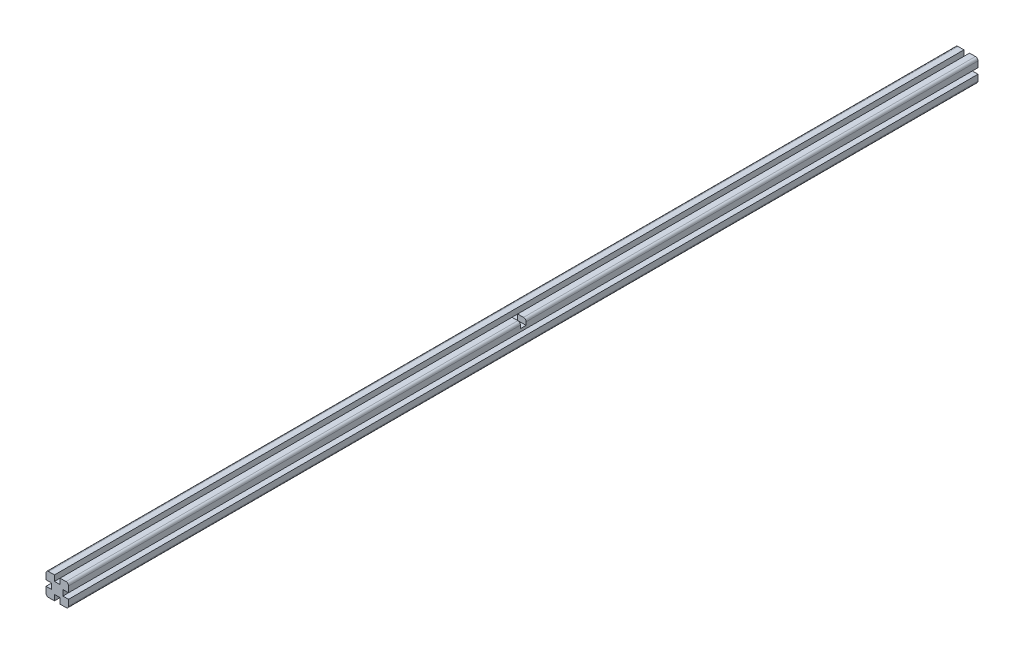
ISO-10303-21;
HEADER;
FILE_DESCRIPTION(('STEP AP214'),'2;1');
FILE_NAME('part.step','',(''),(''),'','','');
FILE_SCHEMA(('AUTOMOTIVE_DESIGN { 1 0 10303 214 1 1 1 1 }'));
ENDSEC;
DATA;
#1=APPLICATION_CONTEXT('core data for automotive mechanical design processes');
#2=APPLICATION_PROTOCOL_DEFINITION('international standard','automotive_design',2000,#1);
#3=PRODUCT_CONTEXT('',#1,'mechanical');
#4=PRODUCT('Part','Part','',(#3));
#5=PRODUCT_RELATED_PRODUCT_CATEGORY('part','',(#4));
#6=PRODUCT_DEFINITION_FORMATION('','',#4);
#7=PRODUCT_DEFINITION_CONTEXT('part definition',#1,'design');
#8=PRODUCT_DEFINITION('design','',#6,#7);
#9=PRODUCT_DEFINITION_SHAPE('','',#8);
#10=(LENGTH_UNIT() NAMED_UNIT(*) SI_UNIT(.MILLI.,.METRE.));
#11=(NAMED_UNIT(*) PLANE_ANGLE_UNIT() SI_UNIT($,.RADIAN.));
#12=(NAMED_UNIT(*) SI_UNIT($,.STERADIAN.) SOLID_ANGLE_UNIT());
#13=UNCERTAINTY_MEASURE_WITH_UNIT(LENGTH_MEASURE(1.E-05),#10,'distance_accuracy_value','');
#14=(GEOMETRIC_REPRESENTATION_CONTEXT(3) GLOBAL_UNCERTAINTY_ASSIGNED_CONTEXT((#13)) GLOBAL_UNIT_ASSIGNED_CONTEXT((#10,
#11,#12)) REPRESENTATION_CONTEXT('',''));
#15=CARTESIAN_POINT('',(0.,0.,0.));
#16=DIRECTION('',(0.,0.,1.));
#17=DIRECTION('',(1.,0.,0.));
#18=AXIS2_PLACEMENT_3D('',#15,#16,#17);
#19=CARTESIAN_POINT('',(15.5,15.5,1615.));
#20=DIRECTION('',(0.,0.,-1.));
#21=DIRECTION('',(-1.,0.,0.));
#22=AXIS2_PLACEMENT_3D('',#19,#20,#21);
#23=CYLINDRICAL_SURFACE('',#22,4.5);
#24=DIRECTION('',(0.,0.,-1.));
#25=VECTOR('',#24,1.);
#26=CARTESIAN_POINT('',(15.5,20.,1615.));
#27=LINE('',#26,#25);
#28=CARTESIAN_POINT('',(15.5,20.,802.5));
#29=VERTEX_POINT('',#28);
#30=CARTESIAN_POINT('',(15.5,20.,0.));
#31=VERTEX_POINT('',#30);
#32=EDGE_CURVE('E325',#29,#31,#27,.T.);
#33=ORIENTED_EDGE('',*,*,#32,.F.);
#34=CARTESIAN_POINT('',(15.5,15.5,802.5));
#35=DIRECTION('',(0.,0.,-1.));
#36=DIRECTION('',(-1.,0.,0.));
#37=AXIS2_PLACEMENT_3D('',#34,#35,#36);
#38=CIRCLE('',#37,4.5);
#39=CARTESIAN_POINT('',(20.,15.5,802.5));
#40=VERTEX_POINT('',#39);
#41=EDGE_CURVE('E440',#40,#29,#38,.F.);
#42=ORIENTED_EDGE('',*,*,#41,.F.);
#43=DIRECTION('',(0.,0.,-1.));
#44=VECTOR('',#43,1.);
#45=CARTESIAN_POINT('',(20.,15.5,1615.));
#46=LINE('',#45,#44);
#47=CARTESIAN_POINT('',(20.,15.5,0.));
#48=VERTEX_POINT('',#47);
#49=EDGE_CURVE('E329',#40,#48,#46,.T.);
#50=ORIENTED_EDGE('',*,*,#49,.T.);
#51=CARTESIAN_POINT('',(15.5,15.5,0.));
#52=DIRECTION('',(0.,0.,1.));
#53=DIRECTION('',(-1.,0.,0.));
#54=AXIS2_PLACEMENT_3D('',#51,#52,#53);
#55=CIRCLE('',#54,4.5);
#56=EDGE_CURVE('E262',#48,#31,#55,.T.);
#57=ORIENTED_EDGE('',*,*,#56,.T.);
#58=EDGE_LOOP('',(#33,#42,#50,#57));
#59=FACE_BOUND('',#58,.T.);
#60=ADVANCED_FACE('F35',(#59),#23,.T.);
#61=CARTESIAN_POINT('',(4.99999999999999,20.,1615.));
#62=DIRECTION('',(0.,-1.,0.));
#63=DIRECTION('',(0.,0.,-1.));
#64=AXIS2_PLACEMENT_3D('',#61,#62,#63);
#65=PLANE('',#64);
#66=DIRECTION('',(0.,0.,-1.));
#67=VECTOR('',#66,1.);
#68=CARTESIAN_POINT('',(4.99999999999999,20.,1615.));
#69=LINE('',#68,#67);
#70=CARTESIAN_POINT('',(4.99999999999999,20.,802.5));
#71=VERTEX_POINT('',#70);
#72=CARTESIAN_POINT('',(4.99999999999999,20.,0.));
#73=VERTEX_POINT('',#72);
#74=EDGE_CURVE('E321',#71,#73,#69,.T.);
#75=ORIENTED_EDGE('',*,*,#74,.F.);
#76=DIRECTION('',(1.,0.,0.));
#77=VECTOR('',#76,1.);
#78=CARTESIAN_POINT('',(-20.001,20.,802.5));
#79=LINE('',#78,#77);
#80=EDGE_CURVE('E434',#71,#29,#79,.T.);
#81=ORIENTED_EDGE('',*,*,#80,.T.);
#82=ORIENTED_EDGE('',*,*,#32,.T.);
#83=DIRECTION('',(-1.,0.,0.));
#84=VECTOR('',#83,1.);
#85=CARTESIAN_POINT('',(4.99999999999999,20.,0.));
#86=LINE('',#85,#84);
#87=EDGE_CURVE('E265',#31,#73,#86,.T.);
#88=ORIENTED_EDGE('',*,*,#87,.T.);
#89=EDGE_LOOP('',(#75,#81,#82,#88));
#90=FACE_BOUND('',#89,.T.);
#91=ADVANCED_FACE('F479',(#90),#65,.F.);
#92=CARTESIAN_POINT('',(4.99999999999999,20.,1615.));
#93=DIRECTION('',(1.,0.,0.));
#94=DIRECTION('',(0.,1.,0.));
#95=AXIS2_PLACEMENT_3D('',#92,#93,#94);
#96=PLANE('',#95);
#97=DIRECTION('',(0.,0.,-1.));
#98=VECTOR('',#97,1.);
#99=CARTESIAN_POINT('',(5.,10.,1615.));
#100=LINE('',#99,#98);
#101=CARTESIAN_POINT('',(5.,10.,802.5));
#102=VERTEX_POINT('',#101);
#103=CARTESIAN_POINT('',(5.,10.,0.));
#104=VERTEX_POINT('',#103);
#105=EDGE_CURVE('E317',#102,#104,#100,.T.);
#106=ORIENTED_EDGE('',*,*,#105,.F.);
#107=DIRECTION('',(0.,-1.,0.));
#108=VECTOR('',#107,1.);
#109=CARTESIAN_POINT('',(5.,10.0000000000001,802.5));
#110=LINE('',#109,#108);
#111=EDGE_CURVE('E50',#71,#102,#110,.T.);
#112=ORIENTED_EDGE('',*,*,#111,.F.);
#113=ORIENTED_EDGE('',*,*,#74,.T.);
#114=DIRECTION('',(0.,-1.,0.));
#115=VECTOR('',#114,1.);
#116=CARTESIAN_POINT('',(4.99999999999999,20.,0.));
#117=LINE('',#116,#115);
#118=EDGE_CURVE('E268',#73,#104,#117,.T.);
#119=ORIENTED_EDGE('',*,*,#118,.T.);
#120=EDGE_LOOP('',(#106,#112,#113,#119));
#121=FACE_BOUND('',#120,.T.);
#122=ADVANCED_FACE('F486',(#121),#96,.F.);
#123=CARTESIAN_POINT('',(-5.,-20.,1615.));
#124=DIRECTION('',(-1.,0.,0.));
#125=DIRECTION('',(0.,-1.,0.));
#126=AXIS2_PLACEMENT_3D('',#123,#124,#125);
#127=PLANE('',#126);
#128=DIRECTION('',(0.,1.,0.));
#129=VECTOR('',#128,1.);
#130=CARTESIAN_POINT('',(-5.,-20.,0.));
#131=LINE('',#130,#129);
#132=CARTESIAN_POINT('',(-5.,-20.,0.));
#133=VERTEX_POINT('',#132);
#134=CARTESIAN_POINT('',(-5.,-10.,0.));
#135=VERTEX_POINT('',#134);
#136=EDGE_CURVE('E240',#133,#135,#131,.T.);
#137=ORIENTED_EDGE('',*,*,#136,.T.);
#138=DIRECTION('',(0.,0.,-1.));
#139=VECTOR('',#138,1.);
#140=CARTESIAN_POINT('',(-5.,-10.,1615.));
#141=LINE('',#140,#139);
#142=CARTESIAN_POINT('',(-5.,-10.,1615.));
#143=VERTEX_POINT('',#142);
#144=EDGE_CURVE('E11',#143,#135,#141,.T.);
#145=ORIENTED_EDGE('',*,*,#144,.F.);
#146=DIRECTION('',(0.,1.,0.));
#147=VECTOR('',#146,1.);
#148=CARTESIAN_POINT('',(-5.,-20.,1615.));
#149=LINE('',#148,#147);
#150=CARTESIAN_POINT('',(-5.,-20.,1615.));
#151=VERTEX_POINT('',#150);
#152=EDGE_CURVE('E292',#151,#143,#149,.T.);
#153=ORIENTED_EDGE('',*,*,#152,.F.);
#154=DIRECTION('',(0.,0.,-1.));
#155=VECTOR('',#154,1.);
#156=CARTESIAN_POINT('',(-5.,-20.,1615.));
#157=LINE('',#156,#155);
#158=EDGE_CURVE('E236',#151,#133,#157,.T.);
#159=ORIENTED_EDGE('',*,*,#158,.T.);
#160=EDGE_LOOP('',(#137,#145,#153,#159));
#161=FACE_BOUND('',#160,.T.);
#162=ADVANCED_FACE('F37',(#161),#127,.F.);
#163=CARTESIAN_POINT('',(-5.,-10.,1615.));
#164=DIRECTION('',(0.,1.,0.));
#165=DIRECTION('',(-1.,0.,0.));
#166=AXIS2_PLACEMENT_3D('',#163,#164,#165);
#167=PLANE('',#166);
#168=DIRECTION('',(1.,0.,0.));
#169=VECTOR('',#168,1.);
#170=CARTESIAN_POINT('',(-5.,-10.,0.));
#171=LINE('',#170,#169);
#172=CARTESIAN_POINT('',(5.,-10.,0.));
#173=VERTEX_POINT('',#172);
#174=EDGE_CURVE('E243',#135,#173,#171,.T.);
#175=ORIENTED_EDGE('',*,*,#174,.T.);
#176=DIRECTION('',(0.,0.,-1.));
#177=VECTOR('',#176,1.);
#178=CARTESIAN_POINT('',(5.,-10.,1615.));
#179=LINE('',#178,#177);
#180=CARTESIAN_POINT('',(5.,-10.,1615.));
#181=VERTEX_POINT('',#180);
#182=EDGE_CURVE('E43',#181,#173,#179,.T.);
#183=ORIENTED_EDGE('',*,*,#182,.F.);
#184=DIRECTION('',(1.,0.,0.));
#185=VECTOR('',#184,1.);
#186=CARTESIAN_POINT('',(-5.,-10.,1615.));
#187=LINE('',#186,#185);
#188=EDGE_CURVE('E148',#143,#181,#187,.T.);
#189=ORIENTED_EDGE('',*,*,#188,.F.);
#190=ORIENTED_EDGE('',*,*,#144,.T.);
#191=EDGE_LOOP('',(#175,#183,#189,#190));
#192=FACE_BOUND('',#191,.T.);
#193=ADVANCED_FACE('F751',(#192),#167,.F.);
#194=CARTESIAN_POINT('',(5.,-20.,1615.));
#195=DIRECTION('',(1.,0.,0.));
#196=DIRECTION('',(0.,0.,-1.));
#197=AXIS2_PLACEMENT_3D('',#194,#195,#196);
#198=PLANE('',#197);
#199=DIRECTION('',(0.,-1.,0.));
#200=VECTOR('',#199,1.);
#201=CARTESIAN_POINT('',(5.,-20.,0.));
#202=LINE('',#201,#200);
#203=CARTESIAN_POINT('',(5.,-20.,0.));
#204=VERTEX_POINT('',#203);
#205=EDGE_CURVE('E245',#173,#204,#202,.T.);
#206=ORIENTED_EDGE('',*,*,#205,.T.);
#207=DIRECTION('',(0.,0.,-1.));
#208=VECTOR('',#207,1.);
#209=CARTESIAN_POINT('',(5.,-20.,1615.));
#210=LINE('',#209,#208);
#211=CARTESIAN_POINT('',(5.,-20.,1615.));
#212=VERTEX_POINT('',#211);
#213=EDGE_CURVE('E351',#212,#204,#210,.T.);
#214=ORIENTED_EDGE('',*,*,#213,.F.);
#215=DIRECTION('',(0.,-1.,0.));
#216=VECTOR('',#215,1.);
#217=CARTESIAN_POINT('',(5.,-20.,1615.));
#218=LINE('',#217,#216);
#219=EDGE_CURVE('E359',#181,#212,#218,.T.);
#220=ORIENTED_EDGE('',*,*,#219,.F.);
#221=ORIENTED_EDGE('',*,*,#182,.T.);
#222=EDGE_LOOP('',(#206,#214,#220,#221));
#223=FACE_BOUND('',#222,.T.);
#224=ADVANCED_FACE('F357',(#223),#198,.F.);
#225=CARTESIAN_POINT('',(5.,-20.,1615.));
#226=DIRECTION('',(0.,1.,0.));
#227=DIRECTION('',(0.,0.,1.));
#228=AXIS2_PLACEMENT_3D('',#225,#226,#227);
#229=PLANE('',#228);
#230=DIRECTION('',(1.,0.,0.));
#231=VECTOR('',#230,1.);
#232=CARTESIAN_POINT('',(5.,-20.,0.));
#233=LINE('',#232,#231);
#234=CARTESIAN_POINT('',(15.5,-20.,0.));
#235=VERTEX_POINT('',#234);
#236=EDGE_CURVE('E247',#204,#235,#233,.T.);
#237=ORIENTED_EDGE('',*,*,#236,.T.);
#238=DIRECTION('',(0.,0.,-1.));
#239=VECTOR('',#238,1.);
#240=CARTESIAN_POINT('',(15.5,-20.,1615.));
#241=LINE('',#240,#239);
#242=CARTESIAN_POINT('',(15.5,-20.,1615.));
#243=VERTEX_POINT('',#242);
#244=EDGE_CURVE('E348',#243,#235,#241,.T.);
#245=ORIENTED_EDGE('',*,*,#244,.F.);
#246=DIRECTION('',(1.,0.,0.));
#247=VECTOR('',#246,1.);
#248=CARTESIAN_POINT('',(5.,-20.,1615.));
#249=LINE('',#248,#247);
#250=EDGE_CURVE('E377',#212,#243,#249,.T.);
#251=ORIENTED_EDGE('',*,*,#250,.F.);
#252=ORIENTED_EDGE('',*,*,#213,.T.);
#253=EDGE_LOOP('',(#237,#245,#251,#252));
#254=FACE_BOUND('',#253,.T.);
#255=ADVANCED_FACE('F368',(#254),#229,.F.);
#256=CARTESIAN_POINT('',(15.5,-15.5,1615.));
#257=DIRECTION('',(0.,0.,-1.));
#258=DIRECTION('',(-1.,0.,0.));
#259=AXIS2_PLACEMENT_3D('',#256,#257,#258);
#260=CYLINDRICAL_SURFACE('',#259,4.5);
#261=CARTESIAN_POINT('',(15.5,-15.5,0.));
#262=DIRECTION('',(0.,0.,1.));
#263=DIRECTION('',(1.,0.,0.));
#264=AXIS2_PLACEMENT_3D('',#261,#262,#263);
#265=CIRCLE('',#264,4.5);
#266=CARTESIAN_POINT('',(20.,-15.5,0.));
#267=VERTEX_POINT('',#266);
#268=EDGE_CURVE('E249',#235,#267,#265,.T.);
#269=ORIENTED_EDGE('',*,*,#268,.T.);
#270=DIRECTION('',(0.,0.,-1.));
#271=VECTOR('',#270,1.);
#272=CARTESIAN_POINT('',(20.,-15.5,1615.));
#273=LINE('',#272,#271);
#274=CARTESIAN_POINT('',(20.,-15.5,1615.));
#275=VERTEX_POINT('',#274);
#276=EDGE_CURVE('E345',#275,#267,#273,.T.);
#277=ORIENTED_EDGE('',*,*,#276,.F.);
#278=CARTESIAN_POINT('',(15.5,-15.5,1615.));
#279=DIRECTION('',(0.,0.,1.));
#280=DIRECTION('',(1.,0.,0.));
#281=AXIS2_PLACEMENT_3D('',#278,#279,#280);
#282=CIRCLE('',#281,4.5);
#283=EDGE_CURVE('E374',#243,#275,#282,.T.);
#284=ORIENTED_EDGE('',*,*,#283,.F.);
#285=ORIENTED_EDGE('',*,*,#244,.T.);
#286=EDGE_LOOP('',(#269,#277,#284,#285));
#287=FACE_BOUND('',#286,.T.);
#288=ADVANCED_FACE('F372',(#287),#260,.T.);
#289=CARTESIAN_POINT('',(20.,-15.5,1615.));
#290=DIRECTION('',(-1.,0.,0.));
#291=DIRECTION('',(0.,0.,1.));
#292=AXIS2_PLACEMENT_3D('',#289,#290,#291);
#293=PLANE('',#292);
#294=DIRECTION('',(0.,1.,0.));
#295=VECTOR('',#294,1.);
#296=CARTESIAN_POINT('',(20.,-15.5,0.));
#297=LINE('',#296,#295);
#298=CARTESIAN_POINT('',(20.,-4.99999999999999,0.));
#299=VERTEX_POINT('',#298);
#300=EDGE_CURVE('E251',#267,#299,#297,.T.);
#301=ORIENTED_EDGE('',*,*,#300,.T.);
#302=DIRECTION('',(0.,0.,-1.));
#303=VECTOR('',#302,1.);
#304=CARTESIAN_POINT('',(20.,-4.99999999999999,1615.));
#305=LINE('',#304,#303);
#306=CARTESIAN_POINT('',(20.,-4.99999999999999,1615.));
#307=VERTEX_POINT('',#306);
#308=EDGE_CURVE('E342',#307,#299,#305,.T.);
#309=ORIENTED_EDGE('',*,*,#308,.F.);
#310=DIRECTION('',(0.,1.,0.));
#311=VECTOR('',#310,1.);
#312=CARTESIAN_POINT('',(20.,-15.5,1615.));
#313=LINE('',#312,#311);
#314=EDGE_CURVE('E376',#275,#307,#313,.T.);
#315=ORIENTED_EDGE('',*,*,#314,.F.);
#316=ORIENTED_EDGE('',*,*,#276,.T.);
#317=EDGE_LOOP('',(#301,#309,#315,#316));
#318=FACE_BOUND('',#317,.T.);
#319=ADVANCED_FACE('F534',(#318),#293,.F.);
#320=CARTESIAN_POINT('',(20.,-4.99999999999999,1615.));
#321=DIRECTION('',(0.,-1.,0.));
#322=DIRECTION('',(1.,0.,0.));
#323=AXIS2_PLACEMENT_3D('',#320,#321,#322);
#324=PLANE('',#323);
#325=DIRECTION('',(-1.,0.,0.));
#326=VECTOR('',#325,1.);
#327=CARTESIAN_POINT('',(20.,-4.99999999999999,0.));
#328=LINE('',#327,#326);
#329=CARTESIAN_POINT('',(10.,-5.,0.));
#330=VERTEX_POINT('',#329);
#331=EDGE_CURVE('E253',#299,#330,#328,.T.);
#332=ORIENTED_EDGE('',*,*,#331,.T.);
#333=DIRECTION('',(0.,0.,-1.));
#334=VECTOR('',#333,1.);
#335=CARTESIAN_POINT('',(10.,-5.,1615.));
#336=LINE('',#335,#334);
#337=CARTESIAN_POINT('',(10.,-5.,1615.));
#338=VERTEX_POINT('',#337);
#339=EDGE_CURVE('E339',#338,#330,#336,.T.);
#340=ORIENTED_EDGE('',*,*,#339,.F.);
#341=DIRECTION('',(-1.,0.,0.));
#342=VECTOR('',#341,1.);
#343=CARTESIAN_POINT('',(20.,-4.99999999999999,1615.));
#344=LINE('',#343,#342);
#345=EDGE_CURVE('E379',#307,#338,#344,.T.);
#346=ORIENTED_EDGE('',*,*,#345,.F.);
#347=ORIENTED_EDGE('',*,*,#308,.T.);
#348=EDGE_LOOP('',(#332,#340,#346,#347));
#349=FACE_BOUND('',#348,.T.);
#350=ADVANCED_FACE('F531',(#349),#324,.F.);
#351=CARTESIAN_POINT('',(10.,-5.,1615.));
#352=DIRECTION('',(-1.,0.,0.));
#353=DIRECTION('',(0.,-1.,0.));
#354=AXIS2_PLACEMENT_3D('',#351,#352,#353);
#355=PLANE('',#354);
#356=DIRECTION('',(0.,1.,0.));
#357=VECTOR('',#356,1.);
#358=CARTESIAN_POINT('',(10.,-5.,0.));
#359=LINE('',#358,#357);
#360=CARTESIAN_POINT('',(10.,5.,0.));
#361=VERTEX_POINT('',#360);
#362=EDGE_CURVE('E255',#330,#361,#359,.T.);
#363=ORIENTED_EDGE('',*,*,#362,.T.);
#364=DIRECTION('',(0.,0.,-1.));
#365=VECTOR('',#364,1.);
#366=CARTESIAN_POINT('',(10.,5.,1615.));
#367=LINE('',#366,#365);
#368=CARTESIAN_POINT('',(10.,5.,1615.));
#369=VERTEX_POINT('',#368);
#370=EDGE_CURVE('E336',#369,#361,#367,.T.);
#371=ORIENTED_EDGE('',*,*,#370,.F.);
#372=DIRECTION('',(0.,1.,0.));
#373=VECTOR('',#372,1.);
#374=CARTESIAN_POINT('',(10.,-5.,1615.));
#375=LINE('',#374,#373);
#376=EDGE_CURVE('E385',#338,#369,#375,.T.);
#377=ORIENTED_EDGE('',*,*,#376,.F.);
#378=ORIENTED_EDGE('',*,*,#339,.T.);
#379=EDGE_LOOP('',(#363,#371,#377,#378));
#380=FACE_BOUND('',#379,.T.);
#381=ADVANCED_FACE('F527',(#380),#355,.F.);
#382=CARTESIAN_POINT('',(20.,5.,1615.));
#383=DIRECTION('',(0.,1.,0.));
#384=DIRECTION('',(-1.,0.,0.));
#385=AXIS2_PLACEMENT_3D('',#382,#383,#384);
#386=PLANE('',#385);
#387=DIRECTION('',(1.,0.,0.));
#388=VECTOR('',#387,1.);
#389=CARTESIAN_POINT('',(20.,5.,0.));
#390=LINE('',#389,#388);
#391=CARTESIAN_POINT('',(20.,5.,0.));
#392=VERTEX_POINT('',#391);
#393=EDGE_CURVE('E257',#361,#392,#390,.T.);
#394=ORIENTED_EDGE('',*,*,#393,.T.);
#395=DIRECTION('',(0.,0.,-1.));
#396=VECTOR('',#395,1.);
#397=CARTESIAN_POINT('',(20.,5.,1615.));
#398=LINE('',#397,#396);
#399=CARTESIAN_POINT('',(20.,5.,1615.));
#400=VERTEX_POINT('',#399);
#401=EDGE_CURVE('E333',#400,#392,#398,.T.);
#402=ORIENTED_EDGE('',*,*,#401,.F.);
#403=DIRECTION('',(1.,0.,0.));
#404=VECTOR('',#403,1.);
#405=CARTESIAN_POINT('',(20.,5.,1615.));
#406=LINE('',#405,#404);
#407=EDGE_CURVE('E387',#369,#400,#406,.T.);
#408=ORIENTED_EDGE('',*,*,#407,.F.);
#409=ORIENTED_EDGE('',*,*,#370,.T.);
#410=EDGE_LOOP('',(#394,#402,#408,#409));
#411=FACE_BOUND('',#410,.T.);
#412=ADVANCED_FACE('F523',(#411),#386,.F.);
#413=CARTESIAN_POINT('',(20.,5.,1615.));
#414=DIRECTION('',(-1.,0.,0.));
#415=DIRECTION('',(0.,0.,1.));
#416=AXIS2_PLACEMENT_3D('',#413,#414,#415);
#417=PLANE('',#416);
#418=ORIENTED_EDGE('',*,*,#49,.F.);
#419=DIRECTION('',(0.,1.,0.));
#420=VECTOR('',#419,1.);
#421=CARTESIAN_POINT('',(20.,10.0000000000001,802.5));
#422=LINE('',#421,#420);
#423=CARTESIAN_POINT('',(20.,10.0000000000001,802.5));
#424=VERTEX_POINT('',#423);
#425=EDGE_CURVE('E452',#424,#40,#422,.T.);
#426=ORIENTED_EDGE('',*,*,#425,.F.);
#427=DIRECTION('',(0.,0.,-1.));
#428=VECTOR('',#427,1.);
#429=CARTESIAN_POINT('',(20.,10.,812.5));
#430=LINE('',#429,#428);
#431=CARTESIAN_POINT('',(20.,10.,812.5));
#432=VERTEX_POINT('',#431);
#433=EDGE_CURVE('E435',#432,#424,#430,.T.);
#434=ORIENTED_EDGE('',*,*,#433,.F.);
#435=DIRECTION('',(0.,-1.,0.));
#436=VECTOR('',#435,1.);
#437=CARTESIAN_POINT('',(20.,10.,812.5));
#438=LINE('',#437,#436);
#439=CARTESIAN_POINT('',(20.,15.5,812.5));
#440=VERTEX_POINT('',#439);
#441=EDGE_CURVE('E449',#440,#432,#438,.T.);
#442=ORIENTED_EDGE('',*,*,#441,.F.);
#443=CARTESIAN_POINT('',(20.,15.5,1615.));
#444=VERTEX_POINT('',#443);
#445=EDGE_CURVE('E330',#444,#440,#46,.T.);
#446=ORIENTED_EDGE('',*,*,#445,.F.);
#447=DIRECTION('',(0.,1.,0.));
#448=VECTOR('',#447,1.);
#449=CARTESIAN_POINT('',(20.,5.,1615.));
#450=LINE('',#449,#448);
#451=EDGE_CURVE('E389',#400,#444,#450,.T.);
#452=ORIENTED_EDGE('',*,*,#451,.F.);
#453=ORIENTED_EDGE('',*,*,#401,.T.);
#454=DIRECTION('',(0.,1.,0.));
#455=VECTOR('',#454,1.);
#456=CARTESIAN_POINT('',(20.,5.,0.));
#457=LINE('',#456,#455);
#458=EDGE_CURVE('E259',#392,#48,#457,.T.);
#459=ORIENTED_EDGE('',*,*,#458,.T.);
#460=EDGE_LOOP('',(#418,#426,#434,#442,#446,#452,#453,#459));
#461=FACE_BOUND('',#460,.T.);
#462=ADVANCED_FACE('F468',(#461),#417,.F.);
#463=ORIENTED_EDGE('',*,*,#445,.T.);
#464=CARTESIAN_POINT('',(15.5,15.5,812.5));
#465=DIRECTION('',(0.,0.,1.));
#466=DIRECTION('',(1.,0.,0.));
#467=AXIS2_PLACEMENT_3D('',#464,#465,#466);
#468=CIRCLE('',#467,4.5);
#469=CARTESIAN_POINT('',(15.5,20.,812.5));
#470=VERTEX_POINT('',#469);
#471=EDGE_CURVE('E430',#470,#440,#468,.F.);
#472=ORIENTED_EDGE('',*,*,#471,.F.);
#473=CARTESIAN_POINT('',(15.5,20.,1615.));
#474=VERTEX_POINT('',#473);
#475=EDGE_CURVE('E326',#474,#470,#27,.T.);
#476=ORIENTED_EDGE('',*,*,#475,.F.);
#477=CARTESIAN_POINT('',(15.5,15.5,1615.));
#478=DIRECTION('',(0.,0.,1.));
#479=DIRECTION('',(-1.,0.,0.));
#480=AXIS2_PLACEMENT_3D('',#477,#478,#479);
#481=CIRCLE('',#480,4.5);
#482=EDGE_CURVE('E391',#444,#474,#481,.T.);
#483=ORIENTED_EDGE('',*,*,#482,.F.);
#484=EDGE_LOOP('',(#463,#472,#476,#483));
#485=FACE_BOUND('',#484,.T.);
#486=ADVANCED_FACE('F518',(#485),#23,.T.);
#487=ORIENTED_EDGE('',*,*,#475,.T.);
#488=DIRECTION('',(1.,0.,0.));
#489=VECTOR('',#488,1.);
#490=CARTESIAN_POINT('',(-20.001,20.,812.5));
#491=LINE('',#490,#489);
#492=CARTESIAN_POINT('',(4.99999999999999,20.,812.5));
#493=VERTEX_POINT('',#492);
#494=EDGE_CURVE('E431',#493,#470,#491,.T.);
#495=ORIENTED_EDGE('',*,*,#494,.F.);
#496=CARTESIAN_POINT('',(4.99999999999999,20.,1615.));
#497=VERTEX_POINT('',#496);
#498=EDGE_CURVE('E322',#497,#493,#69,.T.);
#499=ORIENTED_EDGE('',*,*,#498,.F.);
#500=DIRECTION('',(-1.,0.,0.));
#501=VECTOR('',#500,1.);
#502=CARTESIAN_POINT('',(4.99999999999999,20.,1615.));
#503=LINE('',#502,#501);
#504=EDGE_CURVE('E393',#474,#497,#503,.T.);
#505=ORIENTED_EDGE('',*,*,#504,.F.);
#506=EDGE_LOOP('',(#487,#495,#499,#505));
#507=FACE_BOUND('',#506,.T.);
#508=ADVANCED_FACE('F515',(#507),#65,.F.);
#509=ORIENTED_EDGE('',*,*,#498,.T.);
#510=DIRECTION('',(0.,1.,0.));
#511=VECTOR('',#510,1.);
#512=CARTESIAN_POINT('',(5.,10.0000000000001,812.5));
#513=LINE('',#512,#511);
#514=CARTESIAN_POINT('',(5.,10.,812.5));
#515=VERTEX_POINT('',#514);
#516=EDGE_CURVE('E443',#515,#493,#513,.T.);
#517=ORIENTED_EDGE('',*,*,#516,.F.);
#518=CARTESIAN_POINT('',(5.,10.,1615.));
#519=VERTEX_POINT('',#518);
#520=EDGE_CURVE('E318',#519,#515,#100,.T.);
#521=ORIENTED_EDGE('',*,*,#520,.F.);
#522=DIRECTION('',(0.,-1.,0.));
#523=VECTOR('',#522,1.);
#524=CARTESIAN_POINT('',(4.99999999999999,20.,1615.));
#525=LINE('',#524,#523);
#526=EDGE_CURVE('E395',#497,#519,#525,.T.);
#527=ORIENTED_EDGE('',*,*,#526,.F.);
#528=EDGE_LOOP('',(#509,#517,#521,#527));
#529=FACE_BOUND('',#528,.T.);
#530=ADVANCED_FACE('F505',(#529),#96,.F.);
#531=CARTESIAN_POINT('',(5.,10.,1615.));
#532=DIRECTION('',(0.,-1.,0.));
#533=DIRECTION('',(1.,0.,0.));
#534=AXIS2_PLACEMENT_3D('',#531,#532,#533);
#535=PLANE('',#534);
#536=DIRECTION('',(-1.,0.,0.));
#537=VECTOR('',#536,1.);
#538=CARTESIAN_POINT('',(5.,10.,0.));
#539=LINE('',#538,#537);
#540=CARTESIAN_POINT('',(-5.,10.,0.));
#541=VERTEX_POINT('',#540);
#542=EDGE_CURVE('E271',#104,#541,#539,.T.);
#543=ORIENTED_EDGE('',*,*,#542,.T.);
#544=DIRECTION('',(0.,0.,-1.));
#545=VECTOR('',#544,1.);
#546=CARTESIAN_POINT('',(-5.,10.,1615.));
#547=LINE('',#546,#545);
#548=CARTESIAN_POINT('',(-5.,10.,1615.));
#549=VERTEX_POINT('',#548);
#550=EDGE_CURVE('E314',#549,#541,#547,.T.);
#551=ORIENTED_EDGE('',*,*,#550,.F.);
#552=DIRECTION('',(-1.,0.,0.));
#553=VECTOR('',#552,1.);
#554=CARTESIAN_POINT('',(5.,10.,1615.));
#555=LINE('',#554,#553);
#556=EDGE_CURVE('E397',#519,#549,#555,.T.);
#557=ORIENTED_EDGE('',*,*,#556,.F.);
#558=ORIENTED_EDGE('',*,*,#520,.T.);
#559=DIRECTION('',(1.,0.,0.));
#560=VECTOR('',#559,1.);
#561=CARTESIAN_POINT('',(-20.001,10.,812.5));
#562=LINE('',#561,#560);
#563=EDGE_CURVE('E427',#515,#432,#562,.T.);
#564=ORIENTED_EDGE('',*,*,#563,.T.);
#565=ORIENTED_EDGE('',*,*,#433,.T.);
#566=DIRECTION('',(1.,0.,0.));
#567=VECTOR('',#566,1.);
#568=CARTESIAN_POINT('',(-20.001,10.0000000000001,802.5));
#569=LINE('',#568,#567);
#570=EDGE_CURVE('E432',#102,#424,#569,.T.);
#571=ORIENTED_EDGE('',*,*,#570,.F.);
#572=ORIENTED_EDGE('',*,*,#105,.T.);
#573=EDGE_LOOP('',(#543,#551,#557,#558,#564,#565,#571,#572));
#574=FACE_BOUND('',#573,.T.);
#575=ADVANCED_FACE('F488',(#574),#535,.F.);
#576=CARTESIAN_POINT('',(-5.,20.,1615.));
#577=DIRECTION('',(-1.,0.,0.));
#578=DIRECTION('',(0.,-1.,0.));
#579=AXIS2_PLACEMENT_3D('',#576,#577,#578);
#580=PLANE('',#579);
#581=DIRECTION('',(0.,1.,0.));
#582=VECTOR('',#581,1.);
#583=CARTESIAN_POINT('',(-5.,20.,0.));
#584=LINE('',#583,#582);
#585=CARTESIAN_POINT('',(-5.,20.,0.));
#586=VERTEX_POINT('',#585);
#587=EDGE_CURVE('E273',#541,#586,#584,.T.);
#588=ORIENTED_EDGE('',*,*,#587,.T.);
#589=DIRECTION('',(0.,0.,-1.));
#590=VECTOR('',#589,1.);
#591=CARTESIAN_POINT('',(-5.,20.,1615.));
#592=LINE('',#591,#590);
#593=CARTESIAN_POINT('',(-5.,20.,1615.));
#594=VERTEX_POINT('',#593);
#595=EDGE_CURVE('E311',#594,#586,#592,.T.);
#596=ORIENTED_EDGE('',*,*,#595,.F.);
#597=DIRECTION('',(0.,1.,0.));
#598=VECTOR('',#597,1.);
#599=CARTESIAN_POINT('',(-5.,20.,1615.));
#600=LINE('',#599,#598);
#601=EDGE_CURVE('E399',#549,#594,#600,.T.);
#602=ORIENTED_EDGE('',*,*,#601,.F.);
#603=ORIENTED_EDGE('',*,*,#550,.T.);
#604=EDGE_LOOP('',(#588,#596,#602,#603));
#605=FACE_BOUND('',#604,.T.);
#606=ADVANCED_FACE('F575',(#605),#580,.F.);
#607=CARTESIAN_POINT('',(-15.5,20.,1615.));
#608=DIRECTION('',(0.,-1.,0.));
#609=DIRECTION('',(0.,0.,-1.));
#610=AXIS2_PLACEMENT_3D('',#607,#608,#609);
#611=PLANE('',#610);
#612=DIRECTION('',(-1.,0.,0.));
#613=VECTOR('',#612,1.);
#614=CARTESIAN_POINT('',(-15.5,20.,0.));
#615=LINE('',#614,#613);
#616=CARTESIAN_POINT('',(-15.5,20.,0.));
#617=VERTEX_POINT('',#616);
#618=EDGE_CURVE('E276',#586,#617,#615,.T.);
#619=ORIENTED_EDGE('',*,*,#618,.T.);
#620=DIRECTION('',(0.,0.,-1.));
#621=VECTOR('',#620,1.);
#622=CARTESIAN_POINT('',(-15.5,20.,1615.));
#623=LINE('',#622,#621);
#624=CARTESIAN_POINT('',(-15.5,20.,1615.));
#625=VERTEX_POINT('',#624);
#626=EDGE_CURVE('E308',#625,#617,#623,.T.);
#627=ORIENTED_EDGE('',*,*,#626,.F.);
#628=DIRECTION('',(-1.,0.,0.));
#629=VECTOR('',#628,1.);
#630=CARTESIAN_POINT('',(-8.,20.,1615.));
#631=LINE('',#630,#629);
#632=EDGE_CURVE('E401',#594,#625,#631,.T.);
#633=ORIENTED_EDGE('',*,*,#632,.F.);
#634=ORIENTED_EDGE('',*,*,#595,.T.);
#635=EDGE_LOOP('',(#619,#627,#633,#634));
#636=FACE_BOUND('',#635,.T.);
#637=ADVANCED_FACE('F580',(#636),#611,.F.);
#638=CARTESIAN_POINT('',(-15.5,15.5,1615.));
#639=DIRECTION('',(0.,0.,-1.));
#640=DIRECTION('',(-1.,0.,0.));
#641=AXIS2_PLACEMENT_3D('',#638,#639,#640);
#642=CYLINDRICAL_SURFACE('',#641,4.5);
#643=CARTESIAN_POINT('',(-15.5,15.5,0.));
#644=DIRECTION('',(0.,0.,1.));
#645=DIRECTION('',(-1.,0.,0.));
#646=AXIS2_PLACEMENT_3D('',#643,#644,#645);
#647=CIRCLE('',#646,4.5);
#648=CARTESIAN_POINT('',(-20.,15.5,0.));
#649=VERTEX_POINT('',#648);
#650=EDGE_CURVE('E278',#617,#649,#647,.T.);
#651=ORIENTED_EDGE('',*,*,#650,.T.);
#652=DIRECTION('',(0.,0.,-1.));
#653=VECTOR('',#652,1.);
#654=CARTESIAN_POINT('',(-20.,15.5,1615.));
#655=LINE('',#654,#653);
#656=CARTESIAN_POINT('',(-20.,15.5,1615.));
#657=VERTEX_POINT('',#656);
#658=EDGE_CURVE('E305',#657,#649,#655,.T.);
#659=ORIENTED_EDGE('',*,*,#658,.F.);
#660=CARTESIAN_POINT('',(-15.5,15.5,1615.));
#661=DIRECTION('',(0.,0.,1.));
#662=DIRECTION('',(-1.,0.,0.));
#663=AXIS2_PLACEMENT_3D('',#660,#661,#662);
#664=CIRCLE('',#663,4.5);
#665=EDGE_CURVE('E403',#625,#657,#664,.T.);
#666=ORIENTED_EDGE('',*,*,#665,.F.);
#667=ORIENTED_EDGE('',*,*,#626,.T.);
#668=EDGE_LOOP('',(#651,#659,#666,#667));
#669=FACE_BOUND('',#668,.T.);
#670=ADVANCED_FACE('F593',(#669),#642,.T.);
#671=CARTESIAN_POINT('',(-20.,4.99999999999999,1615.));
#672=DIRECTION('',(1.,0.,0.));
#673=DIRECTION('',(0.,0.,-1.));
#674=AXIS2_PLACEMENT_3D('',#671,#672,#673);
#675=PLANE('',#674);
#676=DIRECTION('',(0.,-1.,0.));
#677=VECTOR('',#676,1.);
#678=CARTESIAN_POINT('',(-20.,4.99999999999999,0.));
#679=LINE('',#678,#677);
#680=CARTESIAN_POINT('',(-20.,4.99999999999999,0.));
#681=VERTEX_POINT('',#680);
#682=EDGE_CURVE('E280',#649,#681,#679,.T.);
#683=ORIENTED_EDGE('',*,*,#682,.T.);
#684=DIRECTION('',(0.,0.,-1.));
#685=VECTOR('',#684,1.);
#686=CARTESIAN_POINT('',(-20.,4.99999999999999,1615.));
#687=LINE('',#686,#685);
#688=CARTESIAN_POINT('',(-20.,4.99999999999999,1615.));
#689=VERTEX_POINT('',#688);
#690=EDGE_CURVE('E302',#689,#681,#687,.T.);
#691=ORIENTED_EDGE('',*,*,#690,.F.);
#692=DIRECTION('',(0.,-1.,0.));
#693=VECTOR('',#692,1.);
#694=CARTESIAN_POINT('',(-20.,4.99999999999999,1615.));
#695=LINE('',#694,#693);
#696=EDGE_CURVE('E405',#657,#689,#695,.T.);
#697=ORIENTED_EDGE('',*,*,#696,.F.);
#698=ORIENTED_EDGE('',*,*,#658,.T.);
#699=EDGE_LOOP('',(#683,#691,#697,#698));
#700=FACE_BOUND('',#699,.T.);
#701=ADVANCED_FACE('F604',(#700),#675,.F.);
#702=CARTESIAN_POINT('',(-20.,4.99999999999999,1615.));
#703=DIRECTION('',(0.,1.,0.));
#704=DIRECTION('',(-1.,0.,0.));
#705=AXIS2_PLACEMENT_3D('',#702,#703,#704);
#706=PLANE('',#705);
#707=DIRECTION('',(1.,0.,0.));
#708=VECTOR('',#707,1.);
#709=CARTESIAN_POINT('',(-20.,4.99999999999999,0.));
#710=LINE('',#709,#708);
#711=CARTESIAN_POINT('',(-10.,5.,0.));
#712=VERTEX_POINT('',#711);
#713=EDGE_CURVE('E282',#681,#712,#710,.T.);
#714=ORIENTED_EDGE('',*,*,#713,.T.);
#715=DIRECTION('',(0.,0.,-1.));
#716=VECTOR('',#715,1.);
#717=CARTESIAN_POINT('',(-10.,5.,1615.));
#718=LINE('',#717,#716);
#719=CARTESIAN_POINT('',(-10.,5.,1615.));
#720=VERTEX_POINT('',#719);
#721=EDGE_CURVE('E299',#720,#712,#718,.T.);
#722=ORIENTED_EDGE('',*,*,#721,.F.);
#723=DIRECTION('',(1.,0.,0.));
#724=VECTOR('',#723,1.);
#725=CARTESIAN_POINT('',(-20.,4.99999999999999,1615.));
#726=LINE('',#725,#724);
#727=EDGE_CURVE('E407',#689,#720,#726,.T.);
#728=ORIENTED_EDGE('',*,*,#727,.F.);
#729=ORIENTED_EDGE('',*,*,#690,.T.);
#730=EDGE_LOOP('',(#714,#722,#728,#729));
#731=FACE_BOUND('',#730,.T.);
#732=ADVANCED_FACE('F614',(#731),#706,.F.);
#733=CARTESIAN_POINT('',(-10.,5.,1615.));
#734=DIRECTION('',(1.,0.,0.));
#735=DIRECTION('',(0.,1.,0.));
#736=AXIS2_PLACEMENT_3D('',#733,#734,#735);
#737=PLANE('',#736);
#738=DIRECTION('',(0.,-1.,0.));
#739=VECTOR('',#738,1.);
#740=CARTESIAN_POINT('',(-10.,5.,0.));
#741=LINE('',#740,#739);
#742=CARTESIAN_POINT('',(-10.,-5.,0.));
#743=VERTEX_POINT('',#742);
#744=EDGE_CURVE('E284',#712,#743,#741,.T.);
#745=ORIENTED_EDGE('',*,*,#744,.T.);
#746=DIRECTION('',(0.,0.,-1.));
#747=VECTOR('',#746,1.);
#748=CARTESIAN_POINT('',(-10.,-5.,1615.));
#749=LINE('',#748,#747);
#750=CARTESIAN_POINT('',(-10.,-5.,1615.));
#751=VERTEX_POINT('',#750);
#752=EDGE_CURVE('E296',#751,#743,#749,.T.);
#753=ORIENTED_EDGE('',*,*,#752,.F.);
#754=DIRECTION('',(0.,-1.,0.));
#755=VECTOR('',#754,1.);
#756=CARTESIAN_POINT('',(-10.,5.,1615.));
#757=LINE('',#756,#755);
#758=EDGE_CURVE('E409',#720,#751,#757,.T.);
#759=ORIENTED_EDGE('',*,*,#758,.F.);
#760=ORIENTED_EDGE('',*,*,#721,.T.);
#761=EDGE_LOOP('',(#745,#753,#759,#760));
#762=FACE_BOUND('',#761,.T.);
#763=ADVANCED_FACE('F415',(#762),#737,.F.);
#764=CARTESIAN_POINT('',(-20.,-5.,1615.));
#765=DIRECTION('',(0.,-1.,0.));
#766=DIRECTION('',(0.,0.,-1.));
#767=AXIS2_PLACEMENT_3D('',#764,#765,#766);
#768=PLANE('',#767);
#769=DIRECTION('',(-1.,0.,0.));
#770=VECTOR('',#769,1.);
#771=CARTESIAN_POINT('',(-20.,-5.,0.));
#772=LINE('',#771,#770);
#773=CARTESIAN_POINT('',(-20.,-5.,0.));
#774=VERTEX_POINT('',#773);
#775=EDGE_CURVE('E286',#743,#774,#772,.T.);
#776=ORIENTED_EDGE('',*,*,#775,.T.);
#777=DIRECTION('',(0.,0.,-1.));
#778=VECTOR('',#777,1.);
#779=CARTESIAN_POINT('',(-20.,-5.,1615.));
#780=LINE('',#779,#778);
#781=CARTESIAN_POINT('',(-20.,-5.,1615.));
#782=VERTEX_POINT('',#781);
#783=EDGE_CURVE('E231',#782,#774,#780,.T.);
#784=ORIENTED_EDGE('',*,*,#783,.F.);
#785=DIRECTION('',(-1.,0.,0.));
#786=VECTOR('',#785,1.);
#787=CARTESIAN_POINT('',(-20.,-5.,1615.));
#788=LINE('',#787,#786);
#789=EDGE_CURVE('E219',#751,#782,#788,.T.);
#790=ORIENTED_EDGE('',*,*,#789,.F.);
#791=ORIENTED_EDGE('',*,*,#752,.T.);
#792=EDGE_LOOP('',(#776,#784,#790,#791));
#793=FACE_BOUND('',#792,.T.);
#794=ADVANCED_FACE('F419',(#793),#768,.F.);
#795=CARTESIAN_POINT('',(-20.,-15.5,1615.));
#796=DIRECTION('',(1.,0.,0.));
#797=DIRECTION('',(0.,0.,-1.));
#798=AXIS2_PLACEMENT_3D('',#795,#796,#797);
#799=PLANE('',#798);
#800=DIRECTION('',(0.,-1.,0.));
#801=VECTOR('',#800,1.);
#802=CARTESIAN_POINT('',(-20.,-15.5,0.));
#803=LINE('',#802,#801);
#804=CARTESIAN_POINT('',(-20.,-15.5,0.));
#805=VERTEX_POINT('',#804);
#806=EDGE_CURVE('E228',#774,#805,#803,.T.);
#807=ORIENTED_EDGE('',*,*,#806,.T.);
#808=DIRECTION('',(0.,0.,-1.));
#809=VECTOR('',#808,1.);
#810=CARTESIAN_POINT('',(-20.,-15.5,1615.));
#811=LINE('',#810,#809);
#812=CARTESIAN_POINT('',(-20.,-15.5,1615.));
#813=VERTEX_POINT('',#812);
#814=EDGE_CURVE('E225',#813,#805,#811,.T.);
#815=ORIENTED_EDGE('',*,*,#814,.F.);
#816=DIRECTION('',(0.,-1.,0.));
#817=VECTOR('',#816,1.);
#818=CARTESIAN_POINT('',(-20.,-15.5,1615.));
#819=LINE('',#818,#817);
#820=EDGE_CURVE('E212',#782,#813,#819,.T.);
#821=ORIENTED_EDGE('',*,*,#820,.F.);
#822=ORIENTED_EDGE('',*,*,#783,.T.);
#823=EDGE_LOOP('',(#807,#815,#821,#822));
#824=FACE_BOUND('',#823,.T.);
#825=ADVANCED_FACE('F226',(#824),#799,.F.);
#826=CARTESIAN_POINT('',(-15.5,-15.5,1615.));
#827=DIRECTION('',(0.,0.,-1.));
#828=DIRECTION('',(-1.,0.,0.));
#829=AXIS2_PLACEMENT_3D('',#826,#827,#828);
#830=CYLINDRICAL_SURFACE('',#829,4.5);
#831=CARTESIAN_POINT('',(-15.5,-15.5,0.));
#832=DIRECTION('',(0.,0.,1.));
#833=DIRECTION('',(-1.,0.,0.));
#834=AXIS2_PLACEMENT_3D('',#831,#832,#833);
#835=CIRCLE('',#834,4.5);
#836=CARTESIAN_POINT('',(-15.5,-20.,0.));
#837=VERTEX_POINT('',#836);
#838=EDGE_CURVE('E289',#805,#837,#835,.T.);
#839=ORIENTED_EDGE('',*,*,#838,.T.);
#840=DIRECTION('',(0.,0.,-1.));
#841=VECTOR('',#840,1.);
#842=CARTESIAN_POINT('',(-15.5,-20.,1615.));
#843=LINE('',#842,#841);
#844=CARTESIAN_POINT('',(-15.5,-20.,1615.));
#845=VERTEX_POINT('',#844);
#846=EDGE_CURVE('E232',#845,#837,#843,.T.);
#847=ORIENTED_EDGE('',*,*,#846,.F.);
#848=CARTESIAN_POINT('',(-15.5,-15.5,1615.));
#849=DIRECTION('',(0.,0.,1.));
#850=DIRECTION('',(-1.,0.,0.));
#851=AXIS2_PLACEMENT_3D('',#848,#849,#850);
#852=CIRCLE('',#851,4.5);
#853=EDGE_CURVE('E216',#813,#845,#852,.T.);
#854=ORIENTED_EDGE('',*,*,#853,.F.);
#855=ORIENTED_EDGE('',*,*,#814,.T.);
#856=EDGE_LOOP('',(#839,#847,#854,#855));
#857=FACE_BOUND('',#856,.T.);
#858=ADVANCED_FACE('F234',(#857),#830,.T.);
#859=CARTESIAN_POINT('',(-15.5,-20.,1615.));
#860=DIRECTION('',(0.,1.,0.));
#861=DIRECTION('',(0.,0.,1.));
#862=AXIS2_PLACEMENT_3D('',#859,#860,#861);
#863=PLANE('',#862);
#864=DIRECTION('',(1.,0.,0.));
#865=VECTOR('',#864,1.);
#866=CARTESIAN_POINT('',(-15.5,-20.,0.));
#867=LINE('',#866,#865);
#868=EDGE_CURVE('E140',#837,#133,#867,.T.);
#869=ORIENTED_EDGE('',*,*,#868,.T.);
#870=ORIENTED_EDGE('',*,*,#158,.F.);
#871=DIRECTION('',(1.,0.,0.));
#872=VECTOR('',#871,1.);
#873=CARTESIAN_POINT('',(-15.5,-20.,1615.));
#874=LINE('',#873,#872);
#875=EDGE_CURVE('E59',#845,#151,#874,.T.);
#876=ORIENTED_EDGE('',*,*,#875,.F.);
#877=ORIENTED_EDGE('',*,*,#846,.T.);
#878=EDGE_LOOP('',(#869,#870,#876,#877));
#879=FACE_BOUND('',#878,.T.);
#880=ADVANCED_FACE('F420',(#879),#863,.F.);
#881=CARTESIAN_POINT('',(15.5,-15.5,1615.));
#882=DIRECTION('',(0.,0.,1.));
#883=DIRECTION('',(1.,0.,0.));
#884=AXIS2_PLACEMENT_3D('',#881,#882,#883);
#885=PLANE('',#884);
#886=ORIENTED_EDGE('',*,*,#152,.T.);
#887=ORIENTED_EDGE('',*,*,#188,.T.);
#888=ORIENTED_EDGE('',*,*,#219,.T.);
#889=ORIENTED_EDGE('',*,*,#250,.T.);
#890=ORIENTED_EDGE('',*,*,#283,.T.);
#891=ORIENTED_EDGE('',*,*,#314,.T.);
#892=ORIENTED_EDGE('',*,*,#345,.T.);
#893=ORIENTED_EDGE('',*,*,#376,.T.);
#894=ORIENTED_EDGE('',*,*,#407,.T.);
#895=ORIENTED_EDGE('',*,*,#451,.T.);
#896=ORIENTED_EDGE('',*,*,#482,.T.);
#897=ORIENTED_EDGE('',*,*,#504,.T.);
#898=ORIENTED_EDGE('',*,*,#526,.T.);
#899=ORIENTED_EDGE('',*,*,#556,.T.);
#900=ORIENTED_EDGE('',*,*,#601,.T.);
#901=ORIENTED_EDGE('',*,*,#632,.T.);
#902=ORIENTED_EDGE('',*,*,#665,.T.);
#903=ORIENTED_EDGE('',*,*,#696,.T.);
#904=ORIENTED_EDGE('',*,*,#727,.T.);
#905=ORIENTED_EDGE('',*,*,#758,.T.);
#906=ORIENTED_EDGE('',*,*,#789,.T.);
#907=ORIENTED_EDGE('',*,*,#820,.T.);
#908=ORIENTED_EDGE('',*,*,#853,.T.);
#909=ORIENTED_EDGE('',*,*,#875,.T.);
#910=EDGE_LOOP('',(#886,#887,#888,#889,#890,#891,#892,#893,#894,#895,#896,#897,#898,#899,#900,
#901,#902,#903,#904,#905,#906,#907,#908,#909));
#911=FACE_BOUND('',#910,.T.);
#912=ADVANCED_FACE('F214',(#911),#885,.T.);
#913=CARTESIAN_POINT('',(15.5,-15.5,0.));
#914=DIRECTION('',(0.,0.,1.));
#915=DIRECTION('',(1.,0.,0.));
#916=AXIS2_PLACEMENT_3D('',#913,#914,#915);
#917=PLANE('',#916);
#918=ORIENTED_EDGE('',*,*,#136,.F.);
#919=ORIENTED_EDGE('',*,*,#868,.F.);
#920=ORIENTED_EDGE('',*,*,#838,.F.);
#921=ORIENTED_EDGE('',*,*,#806,.F.);
#922=ORIENTED_EDGE('',*,*,#775,.F.);
#923=ORIENTED_EDGE('',*,*,#744,.F.);
#924=ORIENTED_EDGE('',*,*,#713,.F.);
#925=ORIENTED_EDGE('',*,*,#682,.F.);
#926=ORIENTED_EDGE('',*,*,#650,.F.);
#927=ORIENTED_EDGE('',*,*,#618,.F.);
#928=ORIENTED_EDGE('',*,*,#587,.F.);
#929=ORIENTED_EDGE('',*,*,#542,.F.);
#930=ORIENTED_EDGE('',*,*,#118,.F.);
#931=ORIENTED_EDGE('',*,*,#87,.F.);
#932=ORIENTED_EDGE('',*,*,#56,.F.);
#933=ORIENTED_EDGE('',*,*,#458,.F.);
#934=ORIENTED_EDGE('',*,*,#393,.F.);
#935=ORIENTED_EDGE('',*,*,#362,.F.);
#936=ORIENTED_EDGE('',*,*,#331,.F.);
#937=ORIENTED_EDGE('',*,*,#300,.F.);
#938=ORIENTED_EDGE('',*,*,#268,.F.);
#939=ORIENTED_EDGE('',*,*,#236,.F.);
#940=ORIENTED_EDGE('',*,*,#205,.F.);
#941=ORIENTED_EDGE('',*,*,#174,.F.);
#942=EDGE_LOOP('',(#918,#919,#920,#921,#922,#923,#924,#925,#926,#927,#928,#929,#930,#931,#932,
#933,#934,#935,#936,#937,#938,#939,#940,#941));
#943=FACE_BOUND('',#942,.T.);
#944=ADVANCED_FACE('F363',(#943),#917,.F.);
#945=CARTESIAN_POINT('',(-20.001,10.0000000000001,802.5));
#946=DIRECTION('',(0.,0.,-1.));
#947=DIRECTION('',(-1.,0.,0.));
#948=AXIS2_PLACEMENT_3D('',#945,#946,#947);
#949=PLANE('',#948);
#950=ORIENTED_EDGE('',*,*,#41,.T.);
#951=ORIENTED_EDGE('',*,*,#80,.F.);
#952=ORIENTED_EDGE('',*,*,#111,.T.);
#953=ORIENTED_EDGE('',*,*,#570,.T.);
#954=ORIENTED_EDGE('',*,*,#425,.T.);
#955=EDGE_LOOP('',(#950,#951,#952,#953,#954));
#956=FACE_BOUND('',#955,.T.);
#957=ADVANCED_FACE('F459',(#956),#949,.F.);
#958=CARTESIAN_POINT('',(-20.001,10.,812.5));
#959=DIRECTION('',(0.,0.,1.));
#960=DIRECTION('',(1.,0.,0.));
#961=AXIS2_PLACEMENT_3D('',#958,#959,#960);
#962=PLANE('',#961);
#963=ORIENTED_EDGE('',*,*,#471,.T.);
#964=ORIENTED_EDGE('',*,*,#441,.T.);
#965=ORIENTED_EDGE('',*,*,#563,.F.);
#966=ORIENTED_EDGE('',*,*,#516,.T.);
#967=ORIENTED_EDGE('',*,*,#494,.T.);
#968=EDGE_LOOP('',(#963,#964,#965,#966,#967));
#969=FACE_BOUND('',#968,.T.);
#970=ADVANCED_FACE('F501',(#969),#962,.F.);
#971=CLOSED_SHELL('',(#60,#91,#122,#162,#193,#224,#255,#288,#319,#350,#381,#412,#462,#486,#508,
#530,#575,#606,#637,#670,#701,#732,#763,#794,#825,#858,#880,#912,#944,#957,#970));
#972=MANIFOLD_SOLID_BREP('B2',#971);
#973=ADVANCED_BREP_SHAPE_REPRESENTATION('',(#18,#972),#14);
#974=SHAPE_DEFINITION_REPRESENTATION(#9,#973);
ENDSEC;
END-ISO-10303-21;
